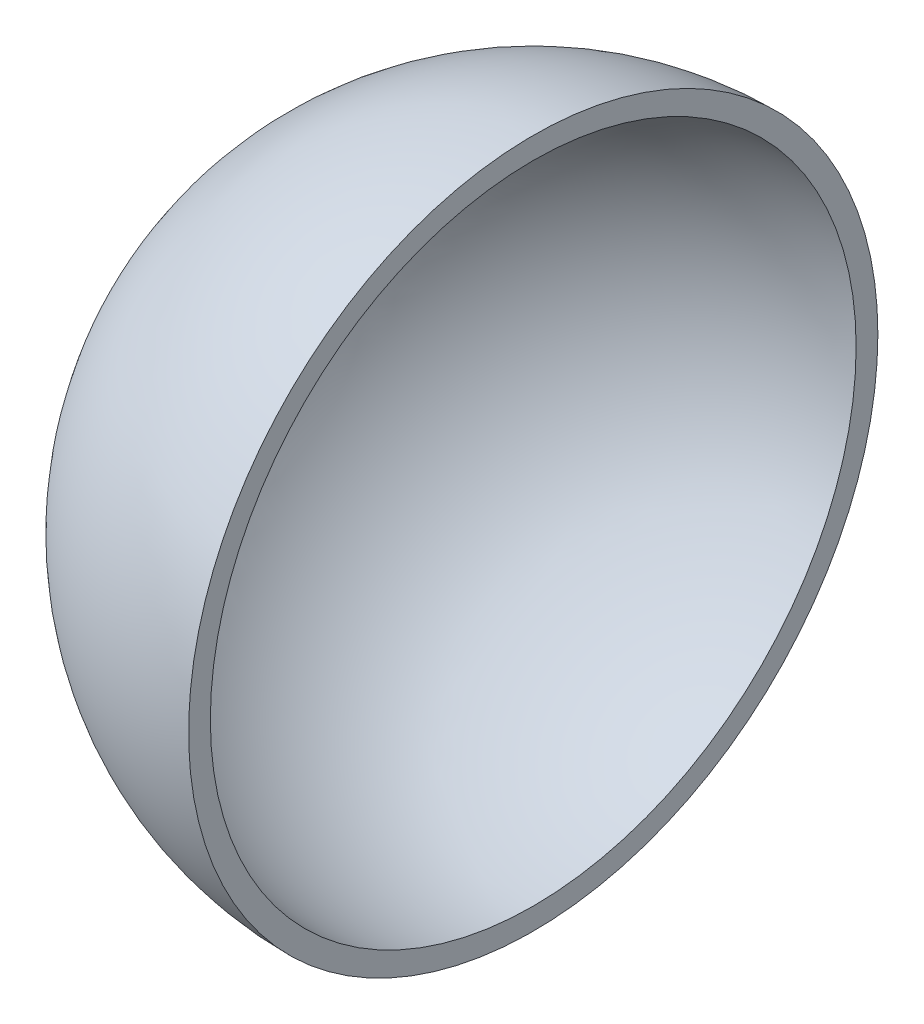
ISO-10303-21;
HEADER;
FILE_DESCRIPTION(('STEP AP214'),'2;1');
FILE_NAME('part.step','',(''),(''),'','','');
FILE_SCHEMA(('AUTOMOTIVE_DESIGN { 1 0 10303 214 1 1 1 1 }'));
ENDSEC;
DATA;
#1=APPLICATION_CONTEXT('core data for automotive mechanical design processes');
#2=APPLICATION_PROTOCOL_DEFINITION('international standard','automotive_design',2000,#1);
#3=PRODUCT_CONTEXT('',#1,'mechanical');
#4=PRODUCT('Part','Part','',(#3));
#5=PRODUCT_RELATED_PRODUCT_CATEGORY('part','',(#4));
#6=PRODUCT_DEFINITION_FORMATION('','',#4);
#7=PRODUCT_DEFINITION_CONTEXT('part definition',#1,'design');
#8=PRODUCT_DEFINITION('design','',#6,#7);
#9=PRODUCT_DEFINITION_SHAPE('','',#8);
#10=(LENGTH_UNIT() NAMED_UNIT(*) SI_UNIT(.MILLI.,.METRE.));
#11=(NAMED_UNIT(*) PLANE_ANGLE_UNIT() SI_UNIT($,.RADIAN.));
#12=(NAMED_UNIT(*) SI_UNIT($,.STERADIAN.) SOLID_ANGLE_UNIT());
#13=UNCERTAINTY_MEASURE_WITH_UNIT(LENGTH_MEASURE(1.E-05),#10,'distance_accuracy_value','');
#14=(GEOMETRIC_REPRESENTATION_CONTEXT(3) GLOBAL_UNCERTAINTY_ASSIGNED_CONTEXT((#13)) GLOBAL_UNIT_ASSIGNED_CONTEXT((#10,
#11,#12)) REPRESENTATION_CONTEXT('',''));
#15=CARTESIAN_POINT('',(0.,0.,0.));
#16=DIRECTION('',(0.,0.,1.));
#17=DIRECTION('',(1.,0.,0.));
#18=AXIS2_PLACEMENT_3D('',#15,#16,#17);
#19=CARTESIAN_POINT('',(-184.933621705964,126.811169487366,0.));
#20=DIRECTION('',(0.,1.,0.));
#21=DIRECTION('',(-1.,0.,0.));
#22=AXIS2_PLACEMENT_3D('',#19,#20,#21);
#23=SPHERICAL_SURFACE('',#22,685.233845533257);
#24=CARTESIAN_POINT('',(-184.933621705964,126.811169487366,0.));
#25=DIRECTION('',(1.,0.,0.));
#26=DIRECTION('',(0.,0.,-1.));
#27=AXIS2_PLACEMENT_3D('',#24,#25,#26);
#28=SPHERICAL_SURFACE('',#27,685.233845533257);
#29=CARTESIAN_POINT('',(-184.933621705964,126.811169487366,0.));
#30=DIRECTION('',(1.,0.,0.));
#31=DIRECTION('',(0.,0.,-1.));
#32=AXIS2_PLACEMENT_3D('',#29,#30,#31);
#33=CIRCLE('',#32,685.233845533257);
#34=CARTESIAN_POINT('',(-184.933621705964,126.811169487366,-685.233845533257));
#35=VERTEX_POINT('',#34);
#36=EDGE_CURVE('E39',#35,#35,#33,.T.);
#37=ORIENTED_EDGE('',*,*,#36,.T.);
#38=EDGE_LOOP('',(#37));
#39=FACE_BOUND('',#38,.T.);
#40=ADVANCED_FACE('F35',(#39),#28,.F.);
#41=CARTESIAN_POINT('',(-184.933621705964,858.189722624661,1059.));
#42=DIRECTION('',(1.,0.,0.));
#43=DIRECTION('',(0.,0.,-1.));
#44=AXIS2_PLACEMENT_3D('',#41,#42,#43);
#45=PLANE('',#44);
#46=CARTESIAN_POINT('',(-184.933621705964,126.811169487366,0.));
#47=DIRECTION('',(1.,0.,0.));
#48=DIRECTION('',(0.,0.,-1.));
#49=AXIS2_PLACEMENT_3D('',#46,#47,#48);
#50=CIRCLE('',#49,731.378553137295);
#51=CARTESIAN_POINT('',(-184.933621705964,126.811169487366,-731.378553137295));
#52=VERTEX_POINT('',#51);
#53=EDGE_CURVE('E10',#52,#52,#50,.F.);
#54=ORIENTED_EDGE('',*,*,#53,.F.);
#55=EDGE_LOOP('',(#54));
#56=FACE_BOUND('',#55,.T.);
#57=ORIENTED_EDGE('',*,*,#36,.F.);
#58=EDGE_LOOP('',(#57));
#59=FACE_BOUND('',#58,.T.);
#60=ADVANCED_FACE('F49',(#56,#59),#45,.T.);
#61=CARTESIAN_POINT('',(-184.933621705964,126.811169487366,0.));
#62=DIRECTION('',(0.,1.,0.));
#63=DIRECTION('',(1.,0.,0.));
#64=AXIS2_PLACEMENT_3D('',#61,#62,#63);
#65=SPHERICAL_SURFACE('',#64,731.378553137295);
#66=CARTESIAN_POINT('',(-184.933621705964,126.811169487366,0.));
#67=DIRECTION('',(1.,0.,0.));
#68=DIRECTION('',(0.,0.,-1.));
#69=AXIS2_PLACEMENT_3D('',#66,#67,#68);
#70=SPHERICAL_SURFACE('',#69,731.378553137295);
#71=ORIENTED_EDGE('',*,*,#53,.T.);
#72=EDGE_LOOP('',(#71));
#73=FACE_BOUND('',#72,.T.);
#74=ADVANCED_FACE('F37',(#73),#70,.T.);
#75=CLOSED_SHELL('',(#40,#60,#74));
#76=MANIFOLD_SOLID_BREP('B2',#75);
#77=ADVANCED_BREP_SHAPE_REPRESENTATION('',(#18,#76),#14);
#78=SHAPE_DEFINITION_REPRESENTATION(#9,#77);
ENDSEC;
END-ISO-10303-21;
